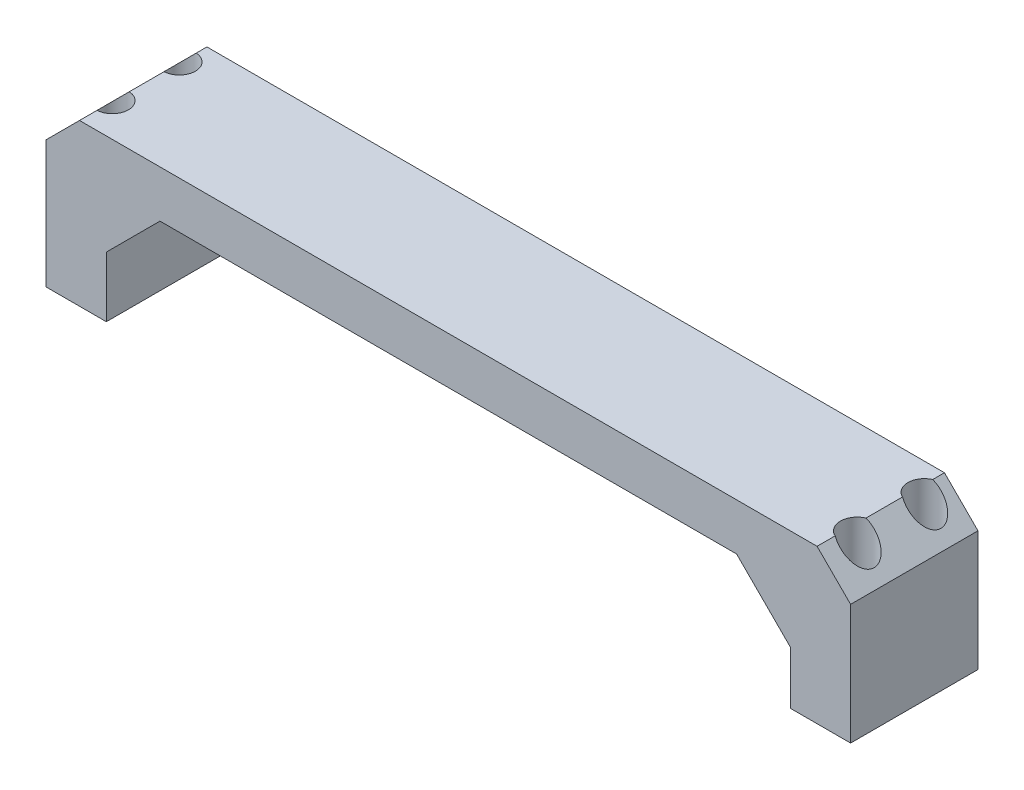
ISO-10303-21;
HEADER;
FILE_DESCRIPTION(('STEP AP214'),'2;1');
FILE_NAME('part.step','',(''),(''),'','','');
FILE_SCHEMA(('AUTOMOTIVE_DESIGN { 1 0 10303 214 1 1 1 1 }'));
ENDSEC;
DATA;
#1=APPLICATION_CONTEXT('core data for automotive mechanical design processes');
#2=APPLICATION_PROTOCOL_DEFINITION('international standard','automotive_design',2000,#1);
#3=PRODUCT_CONTEXT('',#1,'mechanical');
#4=PRODUCT('Part','Part','',(#3));
#5=PRODUCT_RELATED_PRODUCT_CATEGORY('part','',(#4));
#6=PRODUCT_DEFINITION_FORMATION('','',#4);
#7=PRODUCT_DEFINITION_CONTEXT('part definition',#1,'design');
#8=PRODUCT_DEFINITION('design','',#6,#7);
#9=PRODUCT_DEFINITION_SHAPE('','',#8);
#10=(LENGTH_UNIT() NAMED_UNIT(*) SI_UNIT(.MILLI.,.METRE.));
#11=(NAMED_UNIT(*) PLANE_ANGLE_UNIT() SI_UNIT($,.RADIAN.));
#12=(NAMED_UNIT(*) SI_UNIT($,.STERADIAN.) SOLID_ANGLE_UNIT());
#13=UNCERTAINTY_MEASURE_WITH_UNIT(LENGTH_MEASURE(1.E-05),#10,'distance_accuracy_value','');
#14=(GEOMETRIC_REPRESENTATION_CONTEXT(3) GLOBAL_UNCERTAINTY_ASSIGNED_CONTEXT((#13)) GLOBAL_UNIT_ASSIGNED_CONTEXT((#10,
#11,#12)) REPRESENTATION_CONTEXT('',''));
#15=CARTESIAN_POINT('',(0.,0.,0.));
#16=DIRECTION('',(0.,0.,1.));
#17=DIRECTION('',(1.,0.,0.));
#18=AXIS2_PLACEMENT_3D('',#15,#16,#17);
#19=CARTESIAN_POINT('',(-71.0629213483147,0.,-10.16));
#20=DIRECTION('',(-1.,0.,0.));
#21=DIRECTION('',(0.,0.,1.));
#22=AXIS2_PLACEMENT_3D('',#19,#20,#21);
#23=PLANE('',#22);
#24=DIRECTION('',(0.,-1.,0.));
#25=VECTOR('',#24,1.);
#26=CARTESIAN_POINT('',(-71.0629213483147,0.,13.97));
#27=LINE('',#26,#25);
#28=CARTESIAN_POINT('',(-71.0629213483147,6.34999999999989,13.97));
#29=VERTEX_POINT('',#28);
#30=CARTESIAN_POINT('',(-71.0629213483147,-17.78,13.97));
#31=VERTEX_POINT('',#30);
#32=EDGE_CURVE('E322',#29,#31,#27,.T.);
#33=ORIENTED_EDGE('',*,*,#32,.F.);
#34=DIRECTION('',(0.,0.,-1.));
#35=VECTOR('',#34,1.);
#36=CARTESIAN_POINT('',(-71.0629213483147,6.34999999999989,-10.16));
#37=LINE('',#36,#35);
#38=CARTESIAN_POINT('',(-71.0629213483147,6.34999999999989,-10.16));
#39=VERTEX_POINT('',#38);
#40=EDGE_CURVE('E215',#29,#39,#37,.T.);
#41=ORIENTED_EDGE('',*,*,#40,.T.);
#42=DIRECTION('',(0.,-1.,0.));
#43=VECTOR('',#42,1.);
#44=CARTESIAN_POINT('',(-71.0629213483147,0.,-10.16));
#45=LINE('',#44,#43);
#46=CARTESIAN_POINT('',(-71.0629213483147,-17.78,-10.16));
#47=VERTEX_POINT('',#46);
#48=EDGE_CURVE('E306',#39,#47,#45,.T.);
#49=ORIENTED_EDGE('',*,*,#48,.T.);
#50=DIRECTION('',(0.,0.,1.));
#51=VECTOR('',#50,1.);
#52=CARTESIAN_POINT('',(-71.0629213483147,-17.78,-10.16));
#53=LINE('',#52,#51);
#54=EDGE_CURVE('E275',#47,#31,#53,.T.);
#55=ORIENTED_EDGE('',*,*,#54,.T.);
#56=EDGE_LOOP('',(#33,#41,#49,#55));
#57=FACE_BOUND('',#56,.T.);
#58=ADVANCED_FACE('F39',(#57),#23,.T.);
#59=CARTESIAN_POINT('',(0.,12.7,-10.16));
#60=DIRECTION('',(0.,-1.,0.));
#61=DIRECTION('',(1.,0.,0.));
#62=AXIS2_PLACEMENT_3D('',#59,#60,#61);
#63=PLANE('',#62);
#64=DIRECTION('',(0.,0.,1.));
#65=VECTOR('',#64,1.);
#66=CARTESIAN_POINT('',(-64.7129213483147,12.7,13.97));
#67=LINE('',#66,#65);
#68=CARTESIAN_POINT('',(-64.7129213483147,12.7,-10.16));
#69=VERTEX_POINT('',#68);
#70=CARTESIAN_POINT('',(-64.7129213483147,12.7,-8.12418761576254));
#71=VERTEX_POINT('',#70);
#72=EDGE_CURVE('E203',#69,#71,#67,.T.);
#73=ORIENTED_EDGE('',*,*,#72,.T.);
#74=CARTESIAN_POINT('',(-64.8653213482424,12.7,-5.07999999999015));
#75=DIRECTION('',(0.,-1.,0.));
#76=DIRECTION('',(1.,0.,0.));
#77=AXIS2_PLACEMENT_3D('',#74,#75,#76);
#78=CIRCLE('',#77,3.048);
#79=CARTESIAN_POINT('',(-64.7129213483147,12.7,-2.03581238421776));
#80=VERTEX_POINT('',#79);
#81=EDGE_CURVE('E347',#71,#80,#78,.T.);
#82=ORIENTED_EDGE('',*,*,#81,.T.);
#83=CARTESIAN_POINT('',(-64.7129213483147,12.7,4.56103119835024));
#84=VERTEX_POINT('',#83);
#85=EDGE_CURVE('E202',#80,#84,#67,.T.);
#86=ORIENTED_EDGE('',*,*,#85,.T.);
#87=CARTESIAN_POINT('',(-64.8653213482424,12.7,7.60521881412263));
#88=DIRECTION('',(0.,-1.,0.));
#89=DIRECTION('',(1.,0.,0.));
#90=AXIS2_PLACEMENT_3D('',#87,#88,#89);
#91=CIRCLE('',#90,3.048);
#92=CARTESIAN_POINT('',(-64.7129213483147,12.7,10.649406429895));
#93=VERTEX_POINT('',#92);
#94=EDGE_CURVE('E351',#84,#93,#91,.T.);
#95=ORIENTED_EDGE('',*,*,#94,.T.);
#96=CARTESIAN_POINT('',(-64.7129213483147,12.7,13.97));
#97=VERTEX_POINT('',#96);
#98=EDGE_CURVE('E199',#93,#97,#67,.T.);
#99=ORIENTED_EDGE('',*,*,#98,.T.);
#100=DIRECTION('',(1.,0.,0.));
#101=VECTOR('',#100,1.);
#102=CARTESIAN_POINT('',(0.,12.7,13.97));
#103=LINE('',#102,#101);
#104=CARTESIAN_POINT('',(74.9870786516852,12.7,13.97));
#105=VERTEX_POINT('',#104);
#106=EDGE_CURVE('E340',#97,#105,#103,.T.);
#107=ORIENTED_EDGE('',*,*,#106,.T.);
#108=DIRECTION('',(0.,0.,-1.));
#109=VECTOR('',#108,1.);
#110=CARTESIAN_POINT('',(74.9870786516852,12.7,-10.16));
#111=LINE('',#110,#109);
#112=CARTESIAN_POINT('',(74.9870786516852,12.7,10.5472143072501));
#113=VERTEX_POINT('',#112);
#114=EDGE_CURVE('E193',#105,#113,#111,.T.);
#115=ORIENTED_EDGE('',*,*,#114,.T.);
#116=CARTESIAN_POINT('',(76.2570786517448,12.7000000000001,7.62000000000584));
#117=DIRECTION('',(0.,-1.,0.));
#118=DIRECTION('',(1.,0.,0.));
#119=AXIS2_PLACEMENT_3D('',#116,#117,#118);
#120=CIRCLE('',#119,3.19084371298364);
#121=CARTESIAN_POINT('',(74.9870786516851,12.7000000000001,4.69278569276155));
#122=VERTEX_POINT('',#121);
#123=EDGE_CURVE('E184',#113,#122,#120,.T.);
#124=ORIENTED_EDGE('',*,*,#123,.T.);
#125=CARTESIAN_POINT('',(74.9870786516852,12.7,-2.22388165837296));
#126=VERTEX_POINT('',#125);
#127=EDGE_CURVE('E183',#122,#126,#111,.T.);
#128=ORIENTED_EDGE('',*,*,#127,.T.);
#129=CARTESIAN_POINT('',(76.2570786517448,12.7000000000001,-5.07999999999015));
#130=DIRECTION('',(0.,-1.,0.));
#131=DIRECTION('',(1.,0.,0.));
#132=AXIS2_PLACEMENT_3D('',#129,#130,#131);
#133=CIRCLE('',#132,3.12574982707728);
#134=CARTESIAN_POINT('',(74.9870786516851,12.7000000000001,-7.93611834160733));
#135=VERTEX_POINT('',#134);
#136=EDGE_CURVE('E168',#126,#135,#133,.T.);
#137=ORIENTED_EDGE('',*,*,#136,.T.);
#138=CARTESIAN_POINT('',(74.9870786516852,12.7,-10.16));
#139=VERTEX_POINT('',#138);
#140=EDGE_CURVE('E180',#135,#139,#111,.T.);
#141=ORIENTED_EDGE('',*,*,#140,.T.);
#142=DIRECTION('',(1.,0.,0.));
#143=VECTOR('',#142,1.);
#144=CARTESIAN_POINT('',(0.,12.7,-10.16));
#145=LINE('',#144,#143);
#146=EDGE_CURVE('E313',#69,#139,#145,.T.);
#147=ORIENTED_EDGE('',*,*,#146,.F.);
#148=EDGE_LOOP('',(#73,#82,#86,#95,#99,#107,#115,#124,#128,#137,#141,#147));
#149=FACE_BOUND('',#148,.T.);
#150=ADVANCED_FACE('F178',(#149),#63,.F.);
#151=CARTESIAN_POINT('',(81.3370786516853,0.,-10.16));
#152=DIRECTION('',(-1.,0.,0.));
#153=DIRECTION('',(0.,0.,1.));
#154=AXIS2_PLACEMENT_3D('',#151,#152,#153);
#155=PLANE('',#154);
#156=DIRECTION('',(0.,-1.,0.));
#157=VECTOR('',#156,1.);
#158=CARTESIAN_POINT('',(81.3370786516853,0.,-10.16));
#159=LINE('',#158,#157);
#160=CARTESIAN_POINT('',(81.3370786516853,6.34999999999996,-10.16));
#161=VERTEX_POINT('',#160);
#162=CARTESIAN_POINT('',(81.3370786516853,-16.4101123595505,-10.16));
#163=VERTEX_POINT('',#162);
#164=EDGE_CURVE('E311',#161,#163,#159,.T.);
#165=ORIENTED_EDGE('',*,*,#164,.F.);
#166=DIRECTION('',(0.,0.,1.));
#167=VECTOR('',#166,1.);
#168=CARTESIAN_POINT('',(81.3370786516853,6.34999999999996,-10.16));
#169=LINE('',#168,#167);
#170=CARTESIAN_POINT('',(81.3370786516853,6.34999999999996,13.97));
#171=VERTEX_POINT('',#170);
#172=EDGE_CURVE('E222',#161,#171,#169,.T.);
#173=ORIENTED_EDGE('',*,*,#172,.T.);
#174=DIRECTION('',(0.,-1.,0.));
#175=VECTOR('',#174,1.);
#176=CARTESIAN_POINT('',(81.3370786516853,0.,13.97));
#177=LINE('',#176,#175);
#178=CARTESIAN_POINT('',(81.3370786516853,-16.4101123595505,13.97));
#179=VERTEX_POINT('',#178);
#180=EDGE_CURVE('E338',#171,#179,#177,.T.);
#181=ORIENTED_EDGE('',*,*,#180,.T.);
#182=DIRECTION('',(0.,0.,1.));
#183=VECTOR('',#182,1.);
#184=CARTESIAN_POINT('',(81.3370786516853,-16.4101123595505,-10.16));
#185=LINE('',#184,#183);
#186=EDGE_CURVE('E269',#163,#179,#185,.T.);
#187=ORIENTED_EDGE('',*,*,#186,.F.);
#188=EDGE_LOOP('',(#165,#173,#181,#187));
#189=FACE_BOUND('',#188,.T.);
#190=ADVANCED_FACE('F380',(#189),#155,.F.);
#191=CARTESIAN_POINT('',(0.,-16.4101123595506,-10.16));
#192=DIRECTION('',(0.,1.,0.));
#193=DIRECTION('',(-1.,0.,0.));
#194=AXIS2_PLACEMENT_3D('',#191,#192,#193);
#195=PLANE('',#194);
#196=CARTESIAN_POINT('',(76.2570786517448,-16.4101123595505,7.62000000000584));
#197=DIRECTION('',(0.,1.,0.));
#198=DIRECTION('',(-1.,0.,0.));
#199=AXIS2_PLACEMENT_3D('',#196,#197,#198);
#200=CIRCLE('',#199,3.19084371298364);
#201=CARTESIAN_POINT('',(73.0662349387612,-16.4101123595505,7.62000000000584));
#202=VERTEX_POINT('',#201);
#203=EDGE_CURVE('E330',#202,#202,#200,.T.);
#204=ORIENTED_EDGE('',*,*,#203,.T.);
#205=EDGE_LOOP('',(#204));
#206=FACE_BOUND('',#205,.T.);
#207=CARTESIAN_POINT('',(76.2570786517448,-16.4101123595505,-5.07999999999015));
#208=DIRECTION('',(0.,1.,0.));
#209=DIRECTION('',(-1.,0.,0.));
#210=AXIS2_PLACEMENT_3D('',#207,#208,#209);
#211=CIRCLE('',#210,3.12574982707728);
#212=CARTESIAN_POINT('',(73.1313288246675,-16.4101123595505,-5.07999999999015));
#213=VERTEX_POINT('',#212);
#214=EDGE_CURVE('E353',#213,#213,#211,.T.);
#215=ORIENTED_EDGE('',*,*,#214,.T.);
#216=EDGE_LOOP('',(#215));
#217=FACE_BOUND('',#216,.T.);
#218=ORIENTED_EDGE('',*,*,#186,.T.);
#219=DIRECTION('',(-1.,0.,0.));
#220=VECTOR('',#219,1.);
#221=CARTESIAN_POINT('',(0.,-16.4101123595506,13.97));
#222=LINE('',#221,#220);
#223=CARTESIAN_POINT('',(69.9070786516853,-16.4101123595505,13.97));
#224=VERTEX_POINT('',#223);
#225=EDGE_CURVE('E335',#179,#224,#222,.T.);
#226=ORIENTED_EDGE('',*,*,#225,.T.);
#227=DIRECTION('',(0.,0.,1.));
#228=VECTOR('',#227,1.);
#229=CARTESIAN_POINT('',(69.9070786516853,-16.4101123595505,-10.16));
#230=LINE('',#229,#228);
#231=CARTESIAN_POINT('',(69.9070786516853,-16.4101123595505,-10.16));
#232=VERTEX_POINT('',#231);
#233=EDGE_CURVE('E272',#232,#224,#230,.T.);
#234=ORIENTED_EDGE('',*,*,#233,.F.);
#235=DIRECTION('',(-1.,0.,0.));
#236=VECTOR('',#235,1.);
#237=CARTESIAN_POINT('',(0.,-16.4101123595506,-10.16));
#238=LINE('',#237,#236);
#239=EDGE_CURVE('E289',#163,#232,#238,.T.);
#240=ORIENTED_EDGE('',*,*,#239,.F.);
#241=EDGE_LOOP('',(#218,#226,#234,#240));
#242=FACE_BOUND('',#241,.T.);
#243=ADVANCED_FACE('F361',(#206,#217,#242),#195,.F.);
#244=CARTESIAN_POINT('',(69.9070786516853,0.,-10.16));
#245=DIRECTION('',(-1.,0.,0.));
#246=DIRECTION('',(0.,-1.,0.));
#247=AXIS2_PLACEMENT_3D('',#244,#245,#246);
#248=PLANE('',#247);
#249=DIRECTION('',(0.,-1.,0.));
#250=VECTOR('',#249,1.);
#251=CARTESIAN_POINT('',(69.9070786516853,0.,13.97));
#252=LINE('',#251,#250);
#253=CARTESIAN_POINT('',(69.9070786516853,-6.35000000000012,13.97));
#254=VERTEX_POINT('',#253);
#255=EDGE_CURVE('E285',#254,#224,#252,.T.);
#256=ORIENTED_EDGE('',*,*,#255,.F.);
#257=DIRECTION('',(0.,0.,-1.));
#258=VECTOR('',#257,1.);
#259=CARTESIAN_POINT('',(69.9070786516853,-6.35000000000012,-10.16));
#260=LINE('',#259,#258);
#261=CARTESIAN_POINT('',(69.9070786516853,-6.35000000000012,-10.16));
#262=VERTEX_POINT('',#261);
#263=EDGE_CURVE('E195',#254,#262,#260,.T.);
#264=ORIENTED_EDGE('',*,*,#263,.T.);
#265=DIRECTION('',(0.,-1.,0.));
#266=VECTOR('',#265,1.);
#267=CARTESIAN_POINT('',(69.9070786516853,0.,-10.16));
#268=LINE('',#267,#266);
#269=EDGE_CURVE('E283',#262,#232,#268,.T.);
#270=ORIENTED_EDGE('',*,*,#269,.T.);
#271=ORIENTED_EDGE('',*,*,#233,.T.);
#272=EDGE_LOOP('',(#256,#264,#270,#271));
#273=FACE_BOUND('',#272,.T.);
#274=ADVANCED_FACE('F281',(#273),#248,.T.);
#275=CARTESIAN_POINT('',(0.,0.,-10.16));
#276=DIRECTION('',(0.,-1.,0.));
#277=DIRECTION('',(1.,0.,0.));
#278=AXIS2_PLACEMENT_3D('',#275,#276,#277);
#279=PLANE('',#278);
#280=DIRECTION('',(0.,0.,-1.));
#281=VECTOR('',#280,1.);
#282=CARTESIAN_POINT('',(-53.2829213483146,0.,-10.16));
#283=LINE('',#282,#281);
#284=CARTESIAN_POINT('',(-53.2829213483146,0.,10.16));
#285=VERTEX_POINT('',#284);
#286=CARTESIAN_POINT('',(-53.2829213483146,0.,-6.34999999999999));
#287=VERTEX_POINT('',#286);
#288=EDGE_CURVE('E262',#285,#287,#283,.T.);
#289=ORIENTED_EDGE('',*,*,#288,.T.);
#290=DIRECTION('',(1.,0.,0.));
#291=VECTOR('',#290,1.);
#292=CARTESIAN_POINT('',(63.5570786516853,0.,-6.34999999999999));
#293=LINE('',#292,#291);
#294=CARTESIAN_POINT('',(63.5570786516853,0.,-6.34999999999999));
#295=VERTEX_POINT('',#294);
#296=EDGE_CURVE('E237',#287,#295,#293,.T.);
#297=ORIENTED_EDGE('',*,*,#296,.T.);
#298=DIRECTION('',(0.,0.,1.));
#299=VECTOR('',#298,1.);
#300=CARTESIAN_POINT('',(63.5570786516853,0.,13.97));
#301=LINE('',#300,#299);
#302=CARTESIAN_POINT('',(63.5570786516853,0.,10.16));
#303=VERTEX_POINT('',#302);
#304=EDGE_CURVE('E253',#295,#303,#301,.T.);
#305=ORIENTED_EDGE('',*,*,#304,.T.);
#306=DIRECTION('',(-1.,0.,0.));
#307=VECTOR('',#306,1.);
#308=CARTESIAN_POINT('',(0.,0.,10.16));
#309=LINE('',#308,#307);
#310=EDGE_CURVE('E235',#303,#285,#309,.T.);
#311=ORIENTED_EDGE('',*,*,#310,.T.);
#312=EDGE_LOOP('',(#289,#297,#305,#311));
#313=FACE_BOUND('',#312,.T.);
#314=ADVANCED_FACE('F259',(#313),#279,.T.);
#315=CARTESIAN_POINT('',(-59.6329213483147,0.,-10.16));
#316=DIRECTION('',(-1.,0.,0.));
#317=DIRECTION('',(0.,-1.,0.));
#318=AXIS2_PLACEMENT_3D('',#315,#316,#317);
#319=PLANE('',#318);
#320=DIRECTION('',(0.,-1.,0.));
#321=VECTOR('',#320,1.);
#322=CARTESIAN_POINT('',(-59.6329213483147,0.,-10.16));
#323=LINE('',#322,#321);
#324=CARTESIAN_POINT('',(-59.6329213483147,-6.35000000000004,-10.16));
#325=VERTEX_POINT('',#324);
#326=CARTESIAN_POINT('',(-59.6329213483147,-17.78,-10.16));
#327=VERTEX_POINT('',#326);
#328=EDGE_CURVE('E291',#325,#327,#323,.T.);
#329=ORIENTED_EDGE('',*,*,#328,.F.);
#330=DIRECTION('',(0.,0.,1.));
#331=VECTOR('',#330,1.);
#332=CARTESIAN_POINT('',(-59.6329213483147,-6.35000000000004,-10.16));
#333=LINE('',#332,#331);
#334=CARTESIAN_POINT('',(-59.6329213483147,-6.35000000000004,13.97));
#335=VERTEX_POINT('',#334);
#336=EDGE_CURVE('E191',#325,#335,#333,.T.);
#337=ORIENTED_EDGE('',*,*,#336,.T.);
#338=DIRECTION('',(0.,-1.,0.));
#339=VECTOR('',#338,1.);
#340=CARTESIAN_POINT('',(-59.6329213483147,0.,13.97));
#341=LINE('',#340,#339);
#342=CARTESIAN_POINT('',(-59.6329213483147,-17.78,13.97));
#343=VERTEX_POINT('',#342);
#344=EDGE_CURVE('E327',#335,#343,#341,.T.);
#345=ORIENTED_EDGE('',*,*,#344,.T.);
#346=DIRECTION('',(0.,0.,1.));
#347=VECTOR('',#346,1.);
#348=CARTESIAN_POINT('',(-59.6329213483147,-17.78,-10.16));
#349=LINE('',#348,#347);
#350=EDGE_CURVE('E302',#327,#343,#349,.T.);
#351=ORIENTED_EDGE('',*,*,#350,.F.);
#352=EDGE_LOOP('',(#329,#337,#345,#351));
#353=FACE_BOUND('',#352,.T.);
#354=ADVANCED_FACE('F300',(#353),#319,.F.);
#355=CARTESIAN_POINT('',(0.,-17.78,-10.16));
#356=DIRECTION('',(0.,-1.,0.));
#357=DIRECTION('',(0.,0.,-1.));
#358=AXIS2_PLACEMENT_3D('',#355,#356,#357);
#359=PLANE('',#358);
#360=CARTESIAN_POINT('',(-64.8653213482424,-17.78,-5.07999999999015));
#361=DIRECTION('',(0.,-1.,0.));
#362=DIRECTION('',(1.,0.,0.));
#363=AXIS2_PLACEMENT_3D('',#360,#361,#362);
#364=CIRCLE('',#363,3.048);
#365=CARTESIAN_POINT('',(-61.8173213482424,-17.78,-5.07999999999015));
#366=VERTEX_POINT('',#365);
#367=EDGE_CURVE('E344',#366,#366,#364,.T.);
#368=ORIENTED_EDGE('',*,*,#367,.F.);
#369=EDGE_LOOP('',(#368));
#370=FACE_BOUND('',#369,.T.);
#371=CARTESIAN_POINT('',(-64.8653213482424,-17.78,7.60521881412263));
#372=DIRECTION('',(0.,-1.,0.));
#373=DIRECTION('',(1.,0.,0.));
#374=AXIS2_PLACEMENT_3D('',#371,#372,#373);
#375=CIRCLE('',#374,3.048);
#376=CARTESIAN_POINT('',(-61.8173213482424,-17.78,7.60521881412263));
#377=VERTEX_POINT('',#376);
#378=EDGE_CURVE('E354',#377,#377,#375,.T.);
#379=ORIENTED_EDGE('',*,*,#378,.F.);
#380=EDGE_LOOP('',(#379));
#381=FACE_BOUND('',#380,.T.);
#382=ORIENTED_EDGE('',*,*,#350,.T.);
#383=DIRECTION('',(1.,0.,0.));
#384=VECTOR('',#383,1.);
#385=CARTESIAN_POINT('',(0.,-17.78,13.97));
#386=LINE('',#385,#384);
#387=EDGE_CURVE('E325',#31,#343,#386,.T.);
#388=ORIENTED_EDGE('',*,*,#387,.F.);
#389=ORIENTED_EDGE('',*,*,#54,.F.);
#390=DIRECTION('',(1.,0.,0.));
#391=VECTOR('',#390,1.);
#392=CARTESIAN_POINT('',(0.,-17.78,-10.16));
#393=LINE('',#392,#391);
#394=EDGE_CURVE('E304',#47,#327,#393,.T.);
#395=ORIENTED_EDGE('',*,*,#394,.T.);
#396=EDGE_LOOP('',(#382,#388,#389,#395));
#397=FACE_BOUND('',#396,.T.);
#398=ADVANCED_FACE('F326',(#370,#381,#397),#359,.T.);
#399=CARTESIAN_POINT('',(0.,0.,-10.16));
#400=DIRECTION('',(0.,0.,1.));
#401=DIRECTION('',(1.,0.,0.));
#402=AXIS2_PLACEMENT_3D('',#399,#400,#401);
#403=PLANE('',#402);
#404=DIRECTION('',(0.707106781186544,-0.707106781186551,0.));
#405=VECTOR('',#404,1.);
#406=CARTESIAN_POINT('',(31.778539325843,31.7785393258426,-10.16));
#407=LINE('',#406,#405);
#408=CARTESIAN_POINT('',(59.7470786516853,3.81000000000001,-10.16));
#409=VERTEX_POINT('',#408);
#410=EDGE_CURVE('E226',#262,#409,#407,.F.);
#411=ORIENTED_EDGE('',*,*,#410,.T.);
#412=DIRECTION('',(-1.,0.,0.));
#413=VECTOR('',#412,1.);
#414=CARTESIAN_POINT('',(-53.2829213483146,3.81000000000001,-10.16));
#415=LINE('',#414,#413);
#416=CARTESIAN_POINT('',(-49.4729213483146,3.81,-10.16));
#417=VERTEX_POINT('',#416);
#418=EDGE_CURVE('E240',#409,#417,#415,.T.);
#419=ORIENTED_EDGE('',*,*,#418,.T.);
#420=DIRECTION('',(-0.707106781186551,-0.707106781186544,0.));
#421=VECTOR('',#420,1.);
#422=CARTESIAN_POINT('',(-26.641460674157,26.6414606741573,-10.16));
#423=LINE('',#422,#421);
#424=EDGE_CURVE('E174',#417,#325,#423,.T.);
#425=ORIENTED_EDGE('',*,*,#424,.T.);
#426=ORIENTED_EDGE('',*,*,#328,.T.);
#427=ORIENTED_EDGE('',*,*,#394,.F.);
#428=ORIENTED_EDGE('',*,*,#48,.F.);
#429=DIRECTION('',(0.707106781186544,0.707106781186551,0.));
#430=VECTOR('',#429,1.);
#431=CARTESIAN_POINT('',(-64.7129213483147,12.7,-10.16));
#432=LINE('',#431,#430);
#433=EDGE_CURVE('E220',#39,#69,#432,.T.);
#434=ORIENTED_EDGE('',*,*,#433,.T.);
#435=ORIENTED_EDGE('',*,*,#146,.T.);
#436=DIRECTION('',(-0.707106781186551,0.707106781186544,0.));
#437=VECTOR('',#436,1.);
#438=CARTESIAN_POINT('',(81.3370786516853,6.34999999999996,-10.16));
#439=LINE('',#438,#437);
#440=EDGE_CURVE('E190',#139,#161,#439,.F.);
#441=ORIENTED_EDGE('',*,*,#440,.T.);
#442=ORIENTED_EDGE('',*,*,#164,.T.);
#443=ORIENTED_EDGE('',*,*,#239,.T.);
#444=ORIENTED_EDGE('',*,*,#269,.F.);
#445=EDGE_LOOP('',(#411,#419,#425,#426,#427,#428,#434,#435,#441,#442,#443,#444));
#446=FACE_BOUND('',#445,.T.);
#447=ADVANCED_FACE('F287',(#446),#403,.F.);
#448=CARTESIAN_POINT('',(0.,0.,13.97));
#449=DIRECTION('',(0.,0.,1.));
#450=DIRECTION('',(1.,0.,0.));
#451=AXIS2_PLACEMENT_3D('',#448,#449,#450);
#452=PLANE('',#451);
#453=DIRECTION('',(1.,0.,0.));
#454=VECTOR('',#453,1.);
#455=CARTESIAN_POINT('',(0.,3.80999999999999,13.97));
#456=LINE('',#455,#454);
#457=CARTESIAN_POINT('',(-49.4729213483146,3.81,13.97));
#458=VERTEX_POINT('',#457);
#459=CARTESIAN_POINT('',(59.7470786516853,3.80999999999999,13.97));
#460=VERTEX_POINT('',#459);
#461=EDGE_CURVE('E243',#458,#460,#456,.T.);
#462=ORIENTED_EDGE('',*,*,#461,.T.);
#463=DIRECTION('',(-0.707106781186544,0.707106781186551,0.));
#464=VECTOR('',#463,1.);
#465=CARTESIAN_POINT('',(63.5570786516853,0.,13.97));
#466=LINE('',#465,#464);
#467=EDGE_CURVE('E55',#460,#254,#466,.F.);
#468=ORIENTED_EDGE('',*,*,#467,.T.);
#469=ORIENTED_EDGE('',*,*,#255,.T.);
#470=ORIENTED_EDGE('',*,*,#225,.F.);
#471=ORIENTED_EDGE('',*,*,#180,.F.);
#472=DIRECTION('',(0.707106781186551,-0.707106781186544,0.));
#473=VECTOR('',#472,1.);
#474=CARTESIAN_POINT('',(43.8435393258423,43.8435393258427,13.97));
#475=LINE('',#474,#473);
#476=EDGE_CURVE('E209',#171,#105,#475,.F.);
#477=ORIENTED_EDGE('',*,*,#476,.T.);
#478=ORIENTED_EDGE('',*,*,#106,.F.);
#479=DIRECTION('',(-0.707106781186544,-0.707106781186551,0.));
#480=VECTOR('',#479,1.);
#481=CARTESIAN_POINT('',(-38.7064606741576,38.7064606741573,13.97));
#482=LINE('',#481,#480);
#483=EDGE_CURVE('E212',#97,#29,#482,.T.);
#484=ORIENTED_EDGE('',*,*,#483,.T.);
#485=ORIENTED_EDGE('',*,*,#32,.T.);
#486=ORIENTED_EDGE('',*,*,#387,.T.);
#487=ORIENTED_EDGE('',*,*,#344,.F.);
#488=DIRECTION('',(0.707106781186551,0.707106781186544,0.));
#489=VECTOR('',#488,1.);
#490=CARTESIAN_POINT('',(-59.6329213483147,-6.35000000000004,13.97));
#491=LINE('',#490,#489);
#492=EDGE_CURVE('E63',#335,#458,#491,.T.);
#493=ORIENTED_EDGE('',*,*,#492,.T.);
#494=EDGE_LOOP('',(#462,#468,#469,#470,#471,#477,#478,#484,#485,#486,#487,#493));
#495=FACE_BOUND('',#494,.T.);
#496=ADVANCED_FACE('F391',(#495),#452,.T.);
#497=CARTESIAN_POINT('',(63.5570786516853,0.,-10.16));
#498=DIRECTION('',(-0.707106781186551,-0.707106781186544,0.));
#499=DIRECTION('',(0.,0.,-1.));
#500=AXIS2_PLACEMENT_3D('',#497,#498,#499);
#501=PLANE('',#500);
#502=ORIENTED_EDGE('',*,*,#410,.F.);
#503=ORIENTED_EDGE('',*,*,#263,.F.);
#504=ORIENTED_EDGE('',*,*,#467,.F.);
#505=DIRECTION('',(0.57735026918962,-0.577350269189627,-0.577350269189631));
#506=VECTOR('',#505,1.);
#507=CARTESIAN_POINT('',(70.3304119850186,-6.77333333333339,3.38666666666654));
#508=LINE('',#507,#506);
#509=EDGE_CURVE('E48',#460,#303,#508,.T.);
#510=ORIENTED_EDGE('',*,*,#509,.T.);
#511=ORIENTED_EDGE('',*,*,#304,.F.);
#512=DIRECTION('',(0.577350269189622,-0.577350269189628,0.577350269189628));
#513=VECTOR('',#512,1.);
#514=CARTESIAN_POINT('',(62.2870786516853,1.27000000000001,-7.62));
#515=LINE('',#514,#513);
#516=EDGE_CURVE('E245',#295,#409,#515,.F.);
#517=ORIENTED_EDGE('',*,*,#516,.T.);
#518=EDGE_LOOP('',(#502,#503,#504,#510,#511,#517));
#519=FACE_BOUND('',#518,.T.);
#520=ADVANCED_FACE('F252',(#519),#501,.T.);
#521=CARTESIAN_POINT('',(-59.6329213483147,-6.35000000000004,-10.16));
#522=DIRECTION('',(-0.707106781186544,0.707106781186551,0.));
#523=DIRECTION('',(0.,0.,1.));
#524=AXIS2_PLACEMENT_3D('',#521,#522,#523);
#525=PLANE('',#524);
#526=ORIENTED_EDGE('',*,*,#424,.F.);
#527=DIRECTION('',(-0.57735026918963,-0.577350269189624,0.577350269189624));
#528=VECTOR('',#527,1.);
#529=CARTESIAN_POINT('',(-56.246254681648,-2.96333333333338,-3.38666666666661));
#530=LINE('',#529,#528);
#531=EDGE_CURVE('E248',#417,#287,#530,.T.);
#532=ORIENTED_EDGE('',*,*,#531,.T.);
#533=ORIENTED_EDGE('',*,*,#288,.F.);
#534=DIRECTION('',(-0.577350269189628,-0.577350269189623,-0.577350269189627));
#535=VECTOR('',#534,1.);
#536=CARTESIAN_POINT('',(-64.2895880149814,-11.0066666666667,-0.846666666666754));
#537=LINE('',#536,#535);
#538=EDGE_CURVE('E11',#285,#458,#537,.F.);
#539=ORIENTED_EDGE('',*,*,#538,.T.);
#540=ORIENTED_EDGE('',*,*,#492,.F.);
#541=ORIENTED_EDGE('',*,*,#336,.F.);
#542=EDGE_LOOP('',(#526,#532,#533,#539,#540,#541));
#543=FACE_BOUND('',#542,.T.);
#544=ADVANCED_FACE('F266',(#543),#525,.F.);
#545=CARTESIAN_POINT('',(-64.7129213483147,12.7,-10.16));
#546=DIRECTION('',(-0.707106781186551,0.707106781186544,0.));
#547=DIRECTION('',(0.,0.,-1.));
#548=AXIS2_PLACEMENT_3D('',#545,#546,#547);
#549=PLANE('',#548);
#550=CARTESIAN_POINT('',(-64.8653213482424,12.5476000000722,-5.07999999999015));
#551=DIRECTION('',(-0.707106781186551,0.707106781186544,0.));
#552=DIRECTION('',(-0.707106781186544,-0.707106781186551,0.));
#553=AXIS2_PLACEMENT_3D('',#550,#551,#552);
#554=ELLIPSE('',#553,4.31052293811321,3.048);
#555=EDGE_CURVE('E233',#71,#80,#554,.T.);
#556=ORIENTED_EDGE('',*,*,#555,.F.);
#557=ORIENTED_EDGE('',*,*,#72,.F.);
#558=ORIENTED_EDGE('',*,*,#433,.F.);
#559=ORIENTED_EDGE('',*,*,#40,.F.);
#560=ORIENTED_EDGE('',*,*,#483,.F.);
#561=ORIENTED_EDGE('',*,*,#98,.F.);
#562=CARTESIAN_POINT('',(-64.8653213482424,12.5476000000722,7.60521881412263));
#563=DIRECTION('',(-0.707106781186551,0.707106781186544,0.));
#564=DIRECTION('',(-0.707106781186544,-0.707106781186551,0.));
#565=AXIS2_PLACEMENT_3D('',#562,#563,#564);
#566=ELLIPSE('',#565,4.31052293811321,3.048);
#567=EDGE_CURVE('E231',#84,#93,#566,.T.);
#568=ORIENTED_EDGE('',*,*,#567,.F.);
#569=ORIENTED_EDGE('',*,*,#85,.F.);
#570=EDGE_LOOP('',(#556,#557,#558,#559,#560,#561,#568,#569));
#571=FACE_BOUND('',#570,.T.);
#572=ADVANCED_FACE('F397',(#571),#549,.T.);
#573=CARTESIAN_POINT('',(81.3370786516853,6.34999999999996,-10.16));
#574=DIRECTION('',(-0.707106781186544,-0.707106781186551,0.));
#575=DIRECTION('',(0.,0.,1.));
#576=AXIS2_PLACEMENT_3D('',#573,#574,#575);
#577=PLANE('',#576);
#578=CARTESIAN_POINT('',(76.2570786517448,11.4299999999404,7.62000000000584));
#579=DIRECTION('',(-0.707106781186544,-0.707106781186551,0.));
#580=DIRECTION('',(0.707106781186551,-0.707106781186544,0.));
#581=AXIS2_PLACEMENT_3D('',#578,#579,#580);
#582=ELLIPSE('',#581,4.51253445431437,3.19084371298364);
#583=EDGE_CURVE('E173',#113,#122,#582,.F.);
#584=ORIENTED_EDGE('',*,*,#583,.F.);
#585=ORIENTED_EDGE('',*,*,#114,.F.);
#586=ORIENTED_EDGE('',*,*,#476,.F.);
#587=ORIENTED_EDGE('',*,*,#172,.F.);
#588=ORIENTED_EDGE('',*,*,#440,.F.);
#589=ORIENTED_EDGE('',*,*,#140,.F.);
#590=CARTESIAN_POINT('',(76.2570786517448,11.4299999999404,-5.07999999999015));
#591=DIRECTION('',(-0.707106781186544,-0.707106781186551,0.));
#592=DIRECTION('',(0.707106781186551,-0.707106781186544,0.));
#593=AXIS2_PLACEMENT_3D('',#590,#591,#592);
#594=ELLIPSE('',#593,4.42047779803803,3.12574982707728);
#595=EDGE_CURVE('E164',#126,#135,#594,.F.);
#596=ORIENTED_EDGE('',*,*,#595,.F.);
#597=ORIENTED_EDGE('',*,*,#127,.F.);
#598=EDGE_LOOP('',(#584,#585,#586,#587,#588,#589,#596,#597));
#599=FACE_BOUND('',#598,.T.);
#600=ADVANCED_FACE('F188',(#599),#577,.F.);
#601=CARTESIAN_POINT('',(76.2570786517448,12.7000000000001,-5.07999999999015));
#602=DIRECTION('',(0.,-1.,0.));
#603=DIRECTION('',(1.,0.,0.));
#604=AXIS2_PLACEMENT_3D('',#601,#602,#603);
#605=CYLINDRICAL_SURFACE('',#604,3.12574982707728);
#606=ORIENTED_EDGE('',*,*,#595,.T.);
#607=ORIENTED_EDGE('',*,*,#136,.F.);
#608=EDGE_LOOP('',(#606,#607));
#609=FACE_BOUND('',#608,.T.);
#610=ORIENTED_EDGE('',*,*,#214,.F.);
#611=EDGE_LOOP('',(#610));
#612=FACE_BOUND('',#611,.T.);
#613=ADVANCED_FACE('F166',(#609,#612),#605,.F.);
#614=CARTESIAN_POINT('',(76.2570786517448,12.7000000000001,7.62000000000584));
#615=DIRECTION('',(0.,-1.,0.));
#616=DIRECTION('',(1.,0.,0.));
#617=AXIS2_PLACEMENT_3D('',#614,#615,#616);
#618=CYLINDRICAL_SURFACE('',#617,3.19084371298364);
#619=ORIENTED_EDGE('',*,*,#583,.T.);
#620=ORIENTED_EDGE('',*,*,#123,.F.);
#621=EDGE_LOOP('',(#619,#620));
#622=FACE_BOUND('',#621,.T.);
#623=ORIENTED_EDGE('',*,*,#203,.F.);
#624=EDGE_LOOP('',(#623));
#625=FACE_BOUND('',#624,.T.);
#626=ADVANCED_FACE('F342',(#622,#625),#618,.F.);
#627=CARTESIAN_POINT('',(-64.8653213482424,12.7,7.60521881412263));
#628=DIRECTION('',(0.,-1.,0.));
#629=DIRECTION('',(1.,0.,0.));
#630=AXIS2_PLACEMENT_3D('',#627,#628,#629);
#631=CYLINDRICAL_SURFACE('',#630,3.048);
#632=ORIENTED_EDGE('',*,*,#567,.T.);
#633=ORIENTED_EDGE('',*,*,#94,.F.);
#634=EDGE_LOOP('',(#632,#633));
#635=FACE_BOUND('',#634,.T.);
#636=ORIENTED_EDGE('',*,*,#378,.T.);
#637=EDGE_LOOP('',(#636));
#638=FACE_BOUND('',#637,.T.);
#639=ADVANCED_FACE('F364',(#635,#638),#631,.F.);
#640=CARTESIAN_POINT('',(-64.8653213482424,12.7,-5.07999999999015));
#641=DIRECTION('',(0.,-1.,0.));
#642=DIRECTION('',(1.,0.,0.));
#643=AXIS2_PLACEMENT_3D('',#640,#641,#642);
#644=CYLINDRICAL_SURFACE('',#643,3.048);
#645=ORIENTED_EDGE('',*,*,#555,.T.);
#646=ORIENTED_EDGE('',*,*,#81,.F.);
#647=EDGE_LOOP('',(#645,#646));
#648=FACE_BOUND('',#647,.T.);
#649=ORIENTED_EDGE('',*,*,#367,.T.);
#650=EDGE_LOOP('',(#649));
#651=FACE_BOUND('',#650,.T.);
#652=ADVANCED_FACE('F370',(#648,#651),#644,.F.);
#653=CARTESIAN_POINT('',(0.,0.,-6.34999999999999));
#654=DIRECTION('',(0.,-0.707106781186548,-0.707106781186548));
#655=DIRECTION('',(-1.,0.,0.));
#656=AXIS2_PLACEMENT_3D('',#653,#654,#655);
#657=PLANE('',#656);
#658=ORIENTED_EDGE('',*,*,#531,.F.);
#659=ORIENTED_EDGE('',*,*,#418,.F.);
#660=ORIENTED_EDGE('',*,*,#516,.F.);
#661=ORIENTED_EDGE('',*,*,#296,.F.);
#662=EDGE_LOOP('',(#658,#659,#660,#661));
#663=FACE_BOUND('',#662,.T.);
#664=ADVANCED_FACE('F295',(#663),#657,.T.);
#665=CARTESIAN_POINT('',(0.,3.80999999999999,13.97));
#666=DIRECTION('',(0.,0.70710678118655,-0.707106781186545));
#667=DIRECTION('',(1.,0.,0.));
#668=AXIS2_PLACEMENT_3D('',#665,#666,#667);
#669=PLANE('',#668);
#670=ORIENTED_EDGE('',*,*,#538,.F.);
#671=ORIENTED_EDGE('',*,*,#310,.F.);
#672=ORIENTED_EDGE('',*,*,#509,.F.);
#673=ORIENTED_EDGE('',*,*,#461,.F.);
#674=EDGE_LOOP('',(#670,#671,#672,#673));
#675=FACE_BOUND('',#674,.T.);
#676=ADVANCED_FACE('F42',(#675),#669,.F.);
#677=CLOSED_SHELL('',(#58,#150,#190,#243,#274,#314,#354,#398,#447,#496,#520,#544,#572,#600,#613,
#626,#639,#652,#664,#676));
#678=MANIFOLD_SOLID_BREP('B2',#677);
#679=ADVANCED_BREP_SHAPE_REPRESENTATION('',(#18,#678),#14);
#680=SHAPE_DEFINITION_REPRESENTATION(#9,#679);
ENDSEC;
END-ISO-10303-21;
